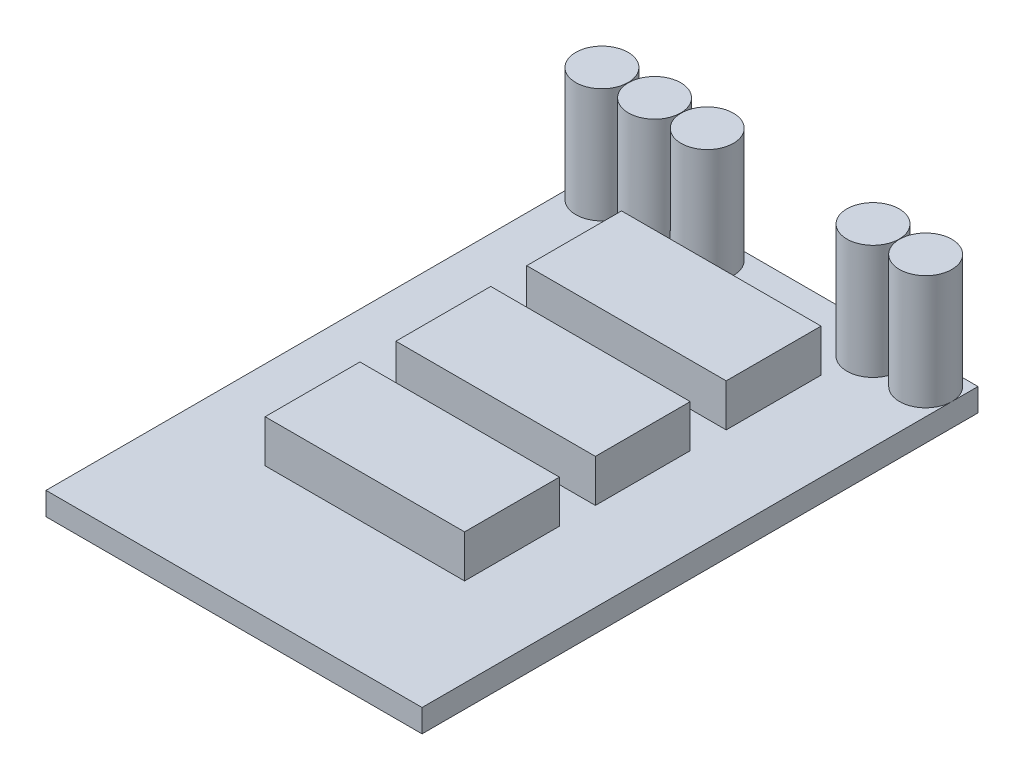
ISO-10303-21;
HEADER;
FILE_DESCRIPTION(('STEP AP214'),'2;1');
FILE_NAME('part.step','',(''),(''),'','','');
FILE_SCHEMA(('AUTOMOTIVE_DESIGN { 1 0 10303 214 1 1 1 1 }'));
ENDSEC;
DATA;
#1=APPLICATION_CONTEXT('core data for automotive mechanical design processes');
#2=APPLICATION_PROTOCOL_DEFINITION('international standard','automotive_design',2000,#1);
#3=PRODUCT_CONTEXT('',#1,'mechanical');
#4=PRODUCT('Part','Part','',(#3));
#5=PRODUCT_RELATED_PRODUCT_CATEGORY('part','',(#4));
#6=PRODUCT_DEFINITION_FORMATION('','',#4);
#7=PRODUCT_DEFINITION_CONTEXT('part definition',#1,'design');
#8=PRODUCT_DEFINITION('design','',#6,#7);
#9=PRODUCT_DEFINITION_SHAPE('','',#8);
#10=(LENGTH_UNIT() NAMED_UNIT(*) SI_UNIT(.MILLI.,.METRE.));
#11=(NAMED_UNIT(*) PLANE_ANGLE_UNIT() SI_UNIT($,.RADIAN.));
#12=(NAMED_UNIT(*) SI_UNIT($,.STERADIAN.) SOLID_ANGLE_UNIT());
#13=UNCERTAINTY_MEASURE_WITH_UNIT(LENGTH_MEASURE(1.E-05),#10,'distance_accuracy_value','');
#14=(GEOMETRIC_REPRESENTATION_CONTEXT(3) GLOBAL_UNCERTAINTY_ASSIGNED_CONTEXT((#13)) GLOBAL_UNIT_ASSIGNED_CONTEXT((#10,
#11,#12)) REPRESENTATION_CONTEXT('',''));
#15=CARTESIAN_POINT('',(0.,0.,0.));
#16=DIRECTION('',(0.,0.,1.));
#17=DIRECTION('',(1.,0.,0.));
#18=AXIS2_PLACEMENT_3D('',#15,#16,#17);
#19=CARTESIAN_POINT('',(0.,7.,0.));
#20=DIRECTION('',(0.,1.,0.));
#21=DIRECTION('',(0.,0.,1.));
#22=AXIS2_PLACEMENT_3D('',#19,#20,#21);
#23=PLANE('',#22);
#24=DIRECTION('',(-1.,0.,0.));
#25=VECTOR('',#24,1.);
#26=CARTESIAN_POINT('',(-57.5,7.,-85.));
#27=LINE('',#26,#25);
#28=CARTESIAN_POINT('',(57.5,7.,-85.));
#29=VERTEX_POINT('',#28);
#30=CARTESIAN_POINT('',(49.5,7.,-85.));
#31=VERTEX_POINT('',#30);
#32=EDGE_CURVE('E179',#29,#31,#27,.T.);
#33=ORIENTED_EDGE('',*,*,#32,.T.);
#34=CARTESIAN_POINT('',(49.5,7.,-77.));
#35=DIRECTION('',(0.,1.,0.));
#36=DIRECTION('',(0.,0.,1.));
#37=AXIS2_PLACEMENT_3D('',#34,#35,#36);
#38=CIRCLE('',#37,8.);
#39=CARTESIAN_POINT('',(57.5,7.,-77.));
#40=VERTEX_POINT('',#39);
#41=EDGE_CURVE('E52',#40,#31,#38,.T.);
#42=ORIENTED_EDGE('',*,*,#41,.F.);
#43=DIRECTION('',(0.,0.,-1.));
#44=VECTOR('',#43,1.);
#45=CARTESIAN_POINT('',(57.5,7.,-85.));
#46=LINE('',#45,#44);
#47=EDGE_CURVE('E177',#40,#29,#46,.T.);
#48=ORIENTED_EDGE('',*,*,#47,.T.);
#49=EDGE_LOOP('',(#33,#42,#48));
#50=FACE_BOUND('',#49,.T.);
#51=ADVANCED_FACE('F38',(#50),#23,.T.);
#52=DIRECTION('',(0.,0.,1.));
#53=VECTOR('',#52,1.);
#54=CARTESIAN_POINT('',(-57.5,7.,-85.));
#55=LINE('',#54,#53);
#56=CARTESIAN_POINT('',(-57.5,7.,-85.));
#57=VERTEX_POINT('',#56);
#58=CARTESIAN_POINT('',(-57.5,7.,-77.));
#59=VERTEX_POINT('',#58);
#60=EDGE_CURVE('E202',#57,#59,#55,.T.);
#61=ORIENTED_EDGE('',*,*,#60,.T.);
#62=CARTESIAN_POINT('',(-49.5,7.,-77.));
#63=DIRECTION('',(0.,1.,0.));
#64=DIRECTION('',(0.,0.,1.));
#65=AXIS2_PLACEMENT_3D('',#62,#63,#64);
#66=CIRCLE('',#65,8.);
#67=CARTESIAN_POINT('',(-49.5,7.,-85.));
#68=VERTEX_POINT('',#67);
#69=EDGE_CURVE('E237',#68,#59,#66,.T.);
#70=ORIENTED_EDGE('',*,*,#69,.F.);
#71=EDGE_CURVE('E194',#68,#57,#27,.T.);
#72=ORIENTED_EDGE('',*,*,#71,.T.);
#73=EDGE_LOOP('',(#61,#70,#72));
#74=FACE_BOUND('',#73,.T.);
#75=ADVANCED_FACE('F236',(#74),#23,.T.);
#76=DIRECTION('',(1.,0.,0.));
#77=VECTOR('',#76,1.);
#78=CARTESIAN_POINT('',(0.,7.,-24.));
#79=LINE('',#78,#77);
#80=CARTESIAN_POINT('',(-30.5,7.,-24.));
#81=VERTEX_POINT('',#80);
#82=CARTESIAN_POINT('',(30.5,7.,-24.));
#83=VERTEX_POINT('',#82);
#84=EDGE_CURVE('E303',#81,#83,#79,.T.);
#85=ORIENTED_EDGE('',*,*,#84,.T.);
#86=DIRECTION('',(0.,0.,1.));
#87=VECTOR('',#86,1.);
#88=CARTESIAN_POINT('',(30.5,7.,0.));
#89=LINE('',#88,#87);
#90=CARTESIAN_POINT('',(30.5,7.,4.99999999999997));
#91=VERTEX_POINT('',#90);
#92=EDGE_CURVE('E308',#83,#91,#89,.T.);
#93=ORIENTED_EDGE('',*,*,#92,.T.);
#94=DIRECTION('',(1.,0.,0.));
#95=VECTOR('',#94,1.);
#96=CARTESIAN_POINT('',(0.,7.,4.99999999999997));
#97=LINE('',#96,#95);
#98=CARTESIAN_POINT('',(-30.5,7.,4.99999999999998));
#99=VERTEX_POINT('',#98);
#100=EDGE_CURVE('E320',#99,#91,#97,.T.);
#101=ORIENTED_EDGE('',*,*,#100,.F.);
#102=DIRECTION('',(0.,0.,1.));
#103=VECTOR('',#102,1.);
#104=CARTESIAN_POINT('',(-30.5,7.,0.));
#105=LINE('',#104,#103);
#106=EDGE_CURVE('E317',#81,#99,#105,.T.);
#107=ORIENTED_EDGE('',*,*,#106,.F.);
#108=EDGE_LOOP('',(#85,#93,#101,#107));
#109=FACE_BOUND('',#108,.T.);
#110=CARTESIAN_POINT('',(57.5,7.,85.));
#111=VERTEX_POINT('',#110);
#112=EDGE_CURVE('E186',#111,#40,#46,.T.);
#113=ORIENTED_EDGE('',*,*,#112,.T.);
#114=EDGE_CURVE('E170',#31,#40,#38,.T.);
#115=ORIENTED_EDGE('',*,*,#114,.F.);
#116=CARTESIAN_POINT('',(33.4,7.,-85.));
#117=VERTEX_POINT('',#116);
#118=EDGE_CURVE('E59',#31,#117,#27,.T.);
#119=ORIENTED_EDGE('',*,*,#118,.T.);
#120=CARTESIAN_POINT('',(33.4,7.,-77.));
#121=DIRECTION('',(0.,1.,0.));
#122=DIRECTION('',(0.,0.,1.));
#123=AXIS2_PLACEMENT_3D('',#120,#121,#122);
#124=CIRCLE('',#123,8.);
#125=EDGE_CURVE('E250',#117,#117,#124,.T.);
#126=ORIENTED_EDGE('',*,*,#125,.F.);
#127=CARTESIAN_POINT('',(-17.3,7.,-85.));
#128=VERTEX_POINT('',#127);
#129=EDGE_CURVE('E245',#117,#128,#27,.T.);
#130=ORIENTED_EDGE('',*,*,#129,.T.);
#131=CARTESIAN_POINT('',(-17.3,7.,-77.));
#132=DIRECTION('',(0.,1.,0.));
#133=DIRECTION('',(0.,0.,1.));
#134=AXIS2_PLACEMENT_3D('',#131,#132,#133);
#135=CIRCLE('',#134,8.00000000000001);
#136=EDGE_CURVE('E249',#128,#128,#135,.T.);
#137=ORIENTED_EDGE('',*,*,#136,.F.);
#138=CARTESIAN_POINT('',(-33.4,7.,-85.));
#139=VERTEX_POINT('',#138);
#140=EDGE_CURVE('E242',#128,#139,#27,.T.);
#141=ORIENTED_EDGE('',*,*,#140,.T.);
#142=CARTESIAN_POINT('',(-33.4,7.,-77.));
#143=DIRECTION('',(0.,1.,0.));
#144=DIRECTION('',(0.,0.,1.));
#145=AXIS2_PLACEMENT_3D('',#142,#143,#144);
#146=CIRCLE('',#145,8.00000000000001);
#147=EDGE_CURVE('E257',#139,#139,#146,.T.);
#148=ORIENTED_EDGE('',*,*,#147,.F.);
#149=EDGE_CURVE('E195',#139,#68,#27,.T.);
#150=ORIENTED_EDGE('',*,*,#149,.T.);
#151=EDGE_CURVE('E266',#59,#68,#66,.T.);
#152=ORIENTED_EDGE('',*,*,#151,.F.);
#153=CARTESIAN_POINT('',(-57.5,7.,85.));
#154=VERTEX_POINT('',#153);
#155=EDGE_CURVE('E201',#59,#154,#55,.T.);
#156=ORIENTED_EDGE('',*,*,#155,.T.);
#157=DIRECTION('',(1.,0.,0.));
#158=VECTOR('',#157,1.);
#159=CARTESIAN_POINT('',(-57.5,7.,85.));
#160=LINE('',#159,#158);
#161=EDGE_CURVE('E192',#154,#111,#160,.T.);
#162=ORIENTED_EDGE('',*,*,#161,.T.);
#163=EDGE_LOOP('',(#113,#115,#119,#126,#130,#137,#141,#148,#150,#152,#156,#162));
#164=FACE_BOUND('',#163,.T.);
#165=DIRECTION('',(0.,0.,1.));
#166=VECTOR('',#165,1.);
#167=CARTESIAN_POINT('',(30.5,7.,0.));
#168=LINE('',#167,#166);
#169=CARTESIAN_POINT('',(30.5,7.,-64.));
#170=VERTEX_POINT('',#169);
#171=CARTESIAN_POINT('',(30.5,7.,-35.));
#172=VERTEX_POINT('',#171);
#173=EDGE_CURVE('E350',#170,#172,#168,.T.);
#174=ORIENTED_EDGE('',*,*,#173,.T.);
#175=DIRECTION('',(1.,0.,0.));
#176=VECTOR('',#175,1.);
#177=CARTESIAN_POINT('',(0.,7.,-35.));
#178=LINE('',#177,#176);
#179=CARTESIAN_POINT('',(-30.5,7.,-35.));
#180=VERTEX_POINT('',#179);
#181=EDGE_CURVE('E335',#180,#172,#178,.T.);
#182=ORIENTED_EDGE('',*,*,#181,.F.);
#183=DIRECTION('',(0.,0.,1.));
#184=VECTOR('',#183,1.);
#185=CARTESIAN_POINT('',(-30.5,7.,0.));
#186=LINE('',#185,#184);
#187=CARTESIAN_POINT('',(-30.5,7.,-64.));
#188=VERTEX_POINT('',#187);
#189=EDGE_CURVE('E339',#188,#180,#186,.T.);
#190=ORIENTED_EDGE('',*,*,#189,.F.);
#191=DIRECTION('',(1.,0.,0.));
#192=VECTOR('',#191,1.);
#193=CARTESIAN_POINT('',(0.,7.,-64.));
#194=LINE('',#193,#192);
#195=EDGE_CURVE('E353',#188,#170,#194,.T.);
#196=ORIENTED_EDGE('',*,*,#195,.T.);
#197=EDGE_LOOP('',(#174,#182,#190,#196));
#198=FACE_BOUND('',#197,.T.);
#199=DIRECTION('',(0.,0.,1.));
#200=VECTOR('',#199,1.);
#201=CARTESIAN_POINT('',(30.5,7.,0.));
#202=LINE('',#201,#200);
#203=CARTESIAN_POINT('',(30.5,7.,16.));
#204=VERTEX_POINT('',#203);
#205=CARTESIAN_POINT('',(30.5,7.,45.));
#206=VERTEX_POINT('',#205);
#207=EDGE_CURVE('E287',#204,#206,#202,.T.);
#208=ORIENTED_EDGE('',*,*,#207,.T.);
#209=DIRECTION('',(1.,0.,0.));
#210=VECTOR('',#209,1.);
#211=CARTESIAN_POINT('',(0.,7.,45.));
#212=LINE('',#211,#210);
#213=CARTESIAN_POINT('',(-30.5,7.,45.));
#214=VERTEX_POINT('',#213);
#215=EDGE_CURVE('E271',#214,#206,#212,.T.);
#216=ORIENTED_EDGE('',*,*,#215,.F.);
#217=DIRECTION('',(0.,0.,1.));
#218=VECTOR('',#217,1.);
#219=CARTESIAN_POINT('',(-30.5,7.,0.));
#220=LINE('',#219,#218);
#221=CARTESIAN_POINT('',(-30.5,7.,16.));
#222=VERTEX_POINT('',#221);
#223=EDGE_CURVE('E276',#222,#214,#220,.T.);
#224=ORIENTED_EDGE('',*,*,#223,.F.);
#225=DIRECTION('',(1.,0.,0.));
#226=VECTOR('',#225,1.);
#227=CARTESIAN_POINT('',(0.,7.,16.));
#228=LINE('',#227,#226);
#229=EDGE_CURVE('E290',#222,#204,#228,.T.);
#230=ORIENTED_EDGE('',*,*,#229,.T.);
#231=EDGE_LOOP('',(#208,#216,#224,#230));
#232=FACE_BOUND('',#231,.T.);
#233=ADVANCED_FACE('F189',(#109,#164,#198,#232),#23,.T.);
#234=CARTESIAN_POINT('',(57.5,7.,-85.));
#235=DIRECTION('',(-1.,0.,0.));
#236=DIRECTION('',(0.,0.,1.));
#237=AXIS2_PLACEMENT_3D('',#234,#235,#236);
#238=PLANE('',#237);
#239=DIRECTION('',(0.,0.,-1.));
#240=VECTOR('',#239,1.);
#241=CARTESIAN_POINT('',(57.5,0.,-85.));
#242=LINE('',#241,#240);
#243=CARTESIAN_POINT('',(57.5,0.,85.));
#244=VERTEX_POINT('',#243);
#245=CARTESIAN_POINT('',(57.5,0.,-85.));
#246=VERTEX_POINT('',#245);
#247=EDGE_CURVE('E207',#244,#246,#242,.T.);
#248=ORIENTED_EDGE('',*,*,#247,.T.);
#249=DIRECTION('',(0.,-1.,0.));
#250=VECTOR('',#249,1.);
#251=CARTESIAN_POINT('',(57.5,7.,-85.));
#252=LINE('',#251,#250);
#253=EDGE_CURVE('E11',#29,#246,#252,.T.);
#254=ORIENTED_EDGE('',*,*,#253,.F.);
#255=ORIENTED_EDGE('',*,*,#47,.F.);
#256=ORIENTED_EDGE('',*,*,#112,.F.);
#257=DIRECTION('',(0.,-1.,0.));
#258=VECTOR('',#257,1.);
#259=CARTESIAN_POINT('',(57.5,7.,85.));
#260=LINE('',#259,#258);
#261=EDGE_CURVE('E206',#111,#244,#260,.T.);
#262=ORIENTED_EDGE('',*,*,#261,.T.);
#263=EDGE_LOOP('',(#248,#254,#255,#256,#262));
#264=FACE_BOUND('',#263,.T.);
#265=ADVANCED_FACE('F40',(#264),#238,.F.);
#266=CARTESIAN_POINT('',(-57.5,7.,-85.));
#267=DIRECTION('',(0.,0.,1.));
#268=DIRECTION('',(1.,0.,0.));
#269=AXIS2_PLACEMENT_3D('',#266,#267,#268);
#270=PLANE('',#269);
#271=DIRECTION('',(-1.,0.,0.));
#272=VECTOR('',#271,1.);
#273=CARTESIAN_POINT('',(-57.5,0.,-85.));
#274=LINE('',#273,#272);
#275=CARTESIAN_POINT('',(-57.5,0.,-85.));
#276=VERTEX_POINT('',#275);
#277=EDGE_CURVE('E209',#246,#276,#274,.T.);
#278=ORIENTED_EDGE('',*,*,#277,.T.);
#279=DIRECTION('',(0.,-1.,0.));
#280=VECTOR('',#279,1.);
#281=CARTESIAN_POINT('',(-57.5,7.,-85.));
#282=LINE('',#281,#280);
#283=EDGE_CURVE('E46',#57,#276,#282,.T.);
#284=ORIENTED_EDGE('',*,*,#283,.F.);
#285=ORIENTED_EDGE('',*,*,#71,.F.);
#286=ORIENTED_EDGE('',*,*,#149,.F.);
#287=ORIENTED_EDGE('',*,*,#140,.F.);
#288=ORIENTED_EDGE('',*,*,#129,.F.);
#289=ORIENTED_EDGE('',*,*,#118,.F.);
#290=ORIENTED_EDGE('',*,*,#32,.F.);
#291=ORIENTED_EDGE('',*,*,#253,.T.);
#292=EDGE_LOOP('',(#278,#284,#285,#286,#287,#288,#289,#290,#291));
#293=FACE_BOUND('',#292,.T.);
#294=ADVANCED_FACE('F239',(#293),#270,.F.);
#295=CARTESIAN_POINT('',(-57.5,7.,-85.));
#296=DIRECTION('',(1.,0.,0.));
#297=DIRECTION('',(0.,0.,-1.));
#298=AXIS2_PLACEMENT_3D('',#295,#296,#297);
#299=PLANE('',#298);
#300=DIRECTION('',(0.,0.,1.));
#301=VECTOR('',#300,1.);
#302=CARTESIAN_POINT('',(-57.5,0.,-85.));
#303=LINE('',#302,#301);
#304=CARTESIAN_POINT('',(-57.5,0.,85.));
#305=VERTEX_POINT('',#304);
#306=EDGE_CURVE('E211',#276,#305,#303,.T.);
#307=ORIENTED_EDGE('',*,*,#306,.T.);
#308=DIRECTION('',(0.,-1.,0.));
#309=VECTOR('',#308,1.);
#310=CARTESIAN_POINT('',(-57.5,7.,85.));
#311=LINE('',#310,#309);
#312=EDGE_CURVE('E215',#154,#305,#311,.T.);
#313=ORIENTED_EDGE('',*,*,#312,.F.);
#314=ORIENTED_EDGE('',*,*,#155,.F.);
#315=ORIENTED_EDGE('',*,*,#60,.F.);
#316=ORIENTED_EDGE('',*,*,#283,.T.);
#317=EDGE_LOOP('',(#307,#313,#314,#315,#316));
#318=FACE_BOUND('',#317,.T.);
#319=ADVANCED_FACE('F222',(#318),#299,.F.);
#320=CARTESIAN_POINT('',(-57.5,7.,85.));
#321=DIRECTION('',(0.,0.,-1.));
#322=DIRECTION('',(-1.,0.,0.));
#323=AXIS2_PLACEMENT_3D('',#320,#321,#322);
#324=PLANE('',#323);
#325=DIRECTION('',(1.,0.,0.));
#326=VECTOR('',#325,1.);
#327=CARTESIAN_POINT('',(-57.5,0.,85.));
#328=LINE('',#327,#326);
#329=EDGE_CURVE('E187',#305,#244,#328,.T.);
#330=ORIENTED_EDGE('',*,*,#329,.T.);
#331=ORIENTED_EDGE('',*,*,#261,.F.);
#332=ORIENTED_EDGE('',*,*,#161,.F.);
#333=ORIENTED_EDGE('',*,*,#312,.T.);
#334=EDGE_LOOP('',(#330,#331,#332,#333));
#335=FACE_BOUND('',#334,.T.);
#336=ADVANCED_FACE('F232',(#335),#324,.F.);
#337=CARTESIAN_POINT('',(0.,0.,0.));
#338=DIRECTION('',(0.,1.,0.));
#339=DIRECTION('',(0.,0.,1.));
#340=AXIS2_PLACEMENT_3D('',#337,#338,#339);
#341=PLANE('',#340);
#342=ORIENTED_EDGE('',*,*,#247,.F.);
#343=ORIENTED_EDGE('',*,*,#329,.F.);
#344=ORIENTED_EDGE('',*,*,#306,.F.);
#345=ORIENTED_EDGE('',*,*,#277,.F.);
#346=EDGE_LOOP('',(#342,#343,#344,#345));
#347=FACE_BOUND('',#346,.T.);
#348=ADVANCED_FACE('F230',(#347),#341,.F.);
#349=CARTESIAN_POINT('',(0.,20.,-35.));
#350=DIRECTION('',(0.,0.,-1.));
#351=DIRECTION('',(-1.,0.,0.));
#352=AXIS2_PLACEMENT_3D('',#349,#350,#351);
#353=PLANE('',#352);
#354=ORIENTED_EDGE('',*,*,#181,.T.);
#355=DIRECTION('',(0.,-1.,0.));
#356=VECTOR('',#355,1.);
#357=CARTESIAN_POINT('',(30.5,20.,-35.));
#358=LINE('',#357,#356);
#359=CARTESIAN_POINT('',(30.5,20.,-35.));
#360=VERTEX_POINT('',#359);
#361=EDGE_CURVE('E198',#360,#172,#358,.T.);
#362=ORIENTED_EDGE('',*,*,#361,.F.);
#363=DIRECTION('',(1.,0.,0.));
#364=VECTOR('',#363,1.);
#365=CARTESIAN_POINT('',(0.,20.,-35.));
#366=LINE('',#365,#364);
#367=CARTESIAN_POINT('',(-30.5,20.,-35.));
#368=VERTEX_POINT('',#367);
#369=EDGE_CURVE('E336',#368,#360,#366,.T.);
#370=ORIENTED_EDGE('',*,*,#369,.F.);
#371=DIRECTION('',(0.,-1.,0.));
#372=VECTOR('',#371,1.);
#373=CARTESIAN_POINT('',(-30.5,20.,-35.));
#374=LINE('',#373,#372);
#375=EDGE_CURVE('E347',#368,#180,#374,.T.);
#376=ORIENTED_EDGE('',*,*,#375,.T.);
#377=EDGE_LOOP('',(#354,#362,#370,#376));
#378=FACE_BOUND('',#377,.T.);
#379=ADVANCED_FACE('F371',(#378),#353,.F.);
#380=CARTESIAN_POINT('',(30.5,20.,0.));
#381=DIRECTION('',(1.,0.,0.));
#382=DIRECTION('',(0.,0.,-1.));
#383=AXIS2_PLACEMENT_3D('',#380,#381,#382);
#384=PLANE('',#383);
#385=ORIENTED_EDGE('',*,*,#173,.F.);
#386=DIRECTION('',(0.,-1.,0.));
#387=VECTOR('',#386,1.);
#388=CARTESIAN_POINT('',(30.5,20.,-64.));
#389=LINE('',#388,#387);
#390=CARTESIAN_POINT('',(30.5,20.,-64.));
#391=VERTEX_POINT('',#390);
#392=EDGE_CURVE('E361',#391,#170,#389,.T.);
#393=ORIENTED_EDGE('',*,*,#392,.F.);
#394=DIRECTION('',(0.,0.,1.));
#395=VECTOR('',#394,1.);
#396=CARTESIAN_POINT('',(30.5,20.,0.));
#397=LINE('',#396,#395);
#398=EDGE_CURVE('E338',#391,#360,#397,.T.);
#399=ORIENTED_EDGE('',*,*,#398,.T.);
#400=ORIENTED_EDGE('',*,*,#361,.T.);
#401=EDGE_LOOP('',(#385,#393,#399,#400));
#402=FACE_BOUND('',#401,.T.);
#403=ADVANCED_FACE('F366',(#402),#384,.T.);
#404=CARTESIAN_POINT('',(0.,20.,-64.));
#405=DIRECTION('',(0.,0.,-1.));
#406=DIRECTION('',(-1.,0.,0.));
#407=AXIS2_PLACEMENT_3D('',#404,#405,#406);
#408=PLANE('',#407);
#409=ORIENTED_EDGE('',*,*,#195,.F.);
#410=DIRECTION('',(0.,-1.,0.));
#411=VECTOR('',#410,1.);
#412=CARTESIAN_POINT('',(-30.5,20.,-64.));
#413=LINE('',#412,#411);
#414=CARTESIAN_POINT('',(-30.5,20.,-64.));
#415=VERTEX_POINT('',#414);
#416=EDGE_CURVE('E359',#415,#188,#413,.T.);
#417=ORIENTED_EDGE('',*,*,#416,.F.);
#418=DIRECTION('',(1.,0.,0.));
#419=VECTOR('',#418,1.);
#420=CARTESIAN_POINT('',(0.,20.,-64.));
#421=LINE('',#420,#419);
#422=EDGE_CURVE('E342',#415,#391,#421,.T.);
#423=ORIENTED_EDGE('',*,*,#422,.T.);
#424=ORIENTED_EDGE('',*,*,#392,.T.);
#425=EDGE_LOOP('',(#409,#417,#423,#424));
#426=FACE_BOUND('',#425,.T.);
#427=ADVANCED_FACE('F375',(#426),#408,.T.);
#428=CARTESIAN_POINT('',(-30.5,20.,0.));
#429=DIRECTION('',(1.,0.,0.));
#430=DIRECTION('',(0.,0.,-1.));
#431=AXIS2_PLACEMENT_3D('',#428,#429,#430);
#432=PLANE('',#431);
#433=ORIENTED_EDGE('',*,*,#189,.T.);
#434=ORIENTED_EDGE('',*,*,#375,.F.);
#435=DIRECTION('',(0.,0.,1.));
#436=VECTOR('',#435,1.);
#437=CARTESIAN_POINT('',(-30.5,20.,0.));
#438=LINE('',#437,#436);
#439=EDGE_CURVE('E345',#415,#368,#438,.T.);
#440=ORIENTED_EDGE('',*,*,#439,.F.);
#441=ORIENTED_EDGE('',*,*,#416,.T.);
#442=EDGE_LOOP('',(#433,#434,#440,#441));
#443=FACE_BOUND('',#442,.T.);
#444=ADVANCED_FACE('F378',(#443),#432,.F.);
#445=CARTESIAN_POINT('',(0.,20.,0.));
#446=DIRECTION('',(0.,1.,0.));
#447=DIRECTION('',(0.,0.,1.));
#448=AXIS2_PLACEMENT_3D('',#445,#446,#447);
#449=PLANE('',#448);
#450=ORIENTED_EDGE('',*,*,#369,.T.);
#451=ORIENTED_EDGE('',*,*,#398,.F.);
#452=ORIENTED_EDGE('',*,*,#422,.F.);
#453=ORIENTED_EDGE('',*,*,#439,.T.);
#454=EDGE_LOOP('',(#450,#451,#452,#453));
#455=FACE_BOUND('',#454,.T.);
#456=ADVANCED_FACE('F381',(#455),#449,.T.);
#457=CARTESIAN_POINT('',(0.,20.,-24.));
#458=DIRECTION('',(0.,0.,-1.));
#459=DIRECTION('',(-1.,0.,0.));
#460=AXIS2_PLACEMENT_3D('',#457,#458,#459);
#461=PLANE('',#460);
#462=ORIENTED_EDGE('',*,*,#84,.F.);
#463=DIRECTION('',(0.,-1.,0.));
#464=VECTOR('',#463,1.);
#465=CARTESIAN_POINT('',(-30.5,20.,-24.));
#466=LINE('',#465,#464);
#467=CARTESIAN_POINT('',(-30.5,20.,-24.));
#468=VERTEX_POINT('',#467);
#469=EDGE_CURVE('E332',#468,#81,#466,.T.);
#470=ORIENTED_EDGE('',*,*,#469,.F.);
#471=DIRECTION('',(1.,0.,0.));
#472=VECTOR('',#471,1.);
#473=CARTESIAN_POINT('',(0.,20.,-24.));
#474=LINE('',#473,#472);
#475=CARTESIAN_POINT('',(30.5,20.,-24.));
#476=VERTEX_POINT('',#475);
#477=EDGE_CURVE('E304',#468,#476,#474,.T.);
#478=ORIENTED_EDGE('',*,*,#477,.T.);
#479=DIRECTION('',(0.,-1.,0.));
#480=VECTOR('',#479,1.);
#481=CARTESIAN_POINT('',(30.5,20.,-24.));
#482=LINE('',#481,#480);
#483=EDGE_CURVE('E315',#476,#83,#482,.T.);
#484=ORIENTED_EDGE('',*,*,#483,.T.);
#485=EDGE_LOOP('',(#462,#470,#478,#484));
#486=FACE_BOUND('',#485,.T.);
#487=ADVANCED_FACE('F383',(#486),#461,.T.);
#488=CARTESIAN_POINT('',(-30.5,20.,0.));
#489=DIRECTION('',(1.,0.,0.));
#490=DIRECTION('',(0.,0.,-1.));
#491=AXIS2_PLACEMENT_3D('',#488,#489,#490);
#492=PLANE('',#491);
#493=ORIENTED_EDGE('',*,*,#106,.T.);
#494=DIRECTION('',(0.,-1.,0.));
#495=VECTOR('',#494,1.);
#496=CARTESIAN_POINT('',(-30.5,20.,4.99999999999998));
#497=LINE('',#496,#495);
#498=CARTESIAN_POINT('',(-30.5,20.,4.99999999999998));
#499=VERTEX_POINT('',#498);
#500=EDGE_CURVE('E329',#499,#99,#497,.T.);
#501=ORIENTED_EDGE('',*,*,#500,.F.);
#502=DIRECTION('',(0.,0.,1.));
#503=VECTOR('',#502,1.);
#504=CARTESIAN_POINT('',(-30.5,20.,0.));
#505=LINE('',#504,#503);
#506=EDGE_CURVE('E307',#468,#499,#505,.T.);
#507=ORIENTED_EDGE('',*,*,#506,.F.);
#508=ORIENTED_EDGE('',*,*,#469,.T.);
#509=EDGE_LOOP('',(#493,#501,#507,#508));
#510=FACE_BOUND('',#509,.T.);
#511=ADVANCED_FACE('F389',(#510),#492,.F.);
#512=CARTESIAN_POINT('',(0.,20.,4.99999999999997));
#513=DIRECTION('',(0.,0.,-1.));
#514=DIRECTION('',(-1.,0.,0.));
#515=AXIS2_PLACEMENT_3D('',#512,#513,#514);
#516=PLANE('',#515);
#517=ORIENTED_EDGE('',*,*,#100,.T.);
#518=DIRECTION('',(0.,-1.,0.));
#519=VECTOR('',#518,1.);
#520=CARTESIAN_POINT('',(30.5,20.,4.99999999999997));
#521=LINE('',#520,#519);
#522=CARTESIAN_POINT('',(30.5,20.,4.99999999999997));
#523=VERTEX_POINT('',#522);
#524=EDGE_CURVE('E326',#523,#91,#521,.T.);
#525=ORIENTED_EDGE('',*,*,#524,.F.);
#526=DIRECTION('',(1.,0.,0.));
#527=VECTOR('',#526,1.);
#528=CARTESIAN_POINT('',(0.,20.,4.99999999999997));
#529=LINE('',#528,#527);
#530=EDGE_CURVE('E310',#499,#523,#529,.T.);
#531=ORIENTED_EDGE('',*,*,#530,.F.);
#532=ORIENTED_EDGE('',*,*,#500,.T.);
#533=EDGE_LOOP('',(#517,#525,#531,#532));
#534=FACE_BOUND('',#533,.T.);
#535=ADVANCED_FACE('F414',(#534),#516,.F.);
#536=CARTESIAN_POINT('',(30.5,20.,0.));
#537=DIRECTION('',(1.,0.,0.));
#538=DIRECTION('',(0.,0.,-1.));
#539=AXIS2_PLACEMENT_3D('',#536,#537,#538);
#540=PLANE('',#539);
#541=ORIENTED_EDGE('',*,*,#92,.F.);
#542=ORIENTED_EDGE('',*,*,#483,.F.);
#543=DIRECTION('',(0.,0.,1.));
#544=VECTOR('',#543,1.);
#545=CARTESIAN_POINT('',(30.5,20.,0.));
#546=LINE('',#545,#544);
#547=EDGE_CURVE('E312',#476,#523,#546,.T.);
#548=ORIENTED_EDGE('',*,*,#547,.T.);
#549=ORIENTED_EDGE('',*,*,#524,.T.);
#550=EDGE_LOOP('',(#541,#542,#548,#549));
#551=FACE_BOUND('',#550,.T.);
#552=ADVANCED_FACE('F410',(#551),#540,.T.);
#553=CARTESIAN_POINT('',(0.,20.,0.));
#554=DIRECTION('',(0.,1.,0.));
#555=DIRECTION('',(0.,0.,1.));
#556=AXIS2_PLACEMENT_3D('',#553,#554,#555);
#557=PLANE('',#556);
#558=ORIENTED_EDGE('',*,*,#477,.F.);
#559=ORIENTED_EDGE('',*,*,#506,.T.);
#560=ORIENTED_EDGE('',*,*,#530,.T.);
#561=ORIENTED_EDGE('',*,*,#547,.F.);
#562=EDGE_LOOP('',(#558,#559,#560,#561));
#563=FACE_BOUND('',#562,.T.);
#564=ADVANCED_FACE('F419',(#563),#557,.T.);
#565=CARTESIAN_POINT('',(0.,20.,45.));
#566=DIRECTION('',(0.,0.,-1.));
#567=DIRECTION('',(-1.,0.,0.));
#568=AXIS2_PLACEMENT_3D('',#565,#566,#567);
#569=PLANE('',#568);
#570=ORIENTED_EDGE('',*,*,#215,.T.);
#571=DIRECTION('',(0.,-1.,0.));
#572=VECTOR('',#571,1.);
#573=CARTESIAN_POINT('',(30.5,20.,45.));
#574=LINE('',#573,#572);
#575=CARTESIAN_POINT('',(30.5,20.,45.));
#576=VERTEX_POINT('',#575);
#577=EDGE_CURVE('E301',#576,#206,#574,.T.);
#578=ORIENTED_EDGE('',*,*,#577,.F.);
#579=DIRECTION('',(1.,0.,0.));
#580=VECTOR('',#579,1.);
#581=CARTESIAN_POINT('',(0.,20.,45.));
#582=LINE('',#581,#580);
#583=CARTESIAN_POINT('',(-30.5,20.,45.));
#584=VERTEX_POINT('',#583);
#585=EDGE_CURVE('E273',#584,#576,#582,.T.);
#586=ORIENTED_EDGE('',*,*,#585,.F.);
#587=DIRECTION('',(0.,-1.,0.));
#588=VECTOR('',#587,1.);
#589=CARTESIAN_POINT('',(-30.5,20.,45.));
#590=LINE('',#589,#588);
#591=EDGE_CURVE('E284',#584,#214,#590,.T.);
#592=ORIENTED_EDGE('',*,*,#591,.T.);
#593=EDGE_LOOP('',(#570,#578,#586,#592));
#594=FACE_BOUND('',#593,.T.);
#595=ADVANCED_FACE('F421',(#594),#569,.F.);
#596=CARTESIAN_POINT('',(30.5,20.,0.));
#597=DIRECTION('',(1.,0.,0.));
#598=DIRECTION('',(0.,0.,-1.));
#599=AXIS2_PLACEMENT_3D('',#596,#597,#598);
#600=PLANE('',#599);
#601=ORIENTED_EDGE('',*,*,#207,.F.);
#602=DIRECTION('',(0.,-1.,0.));
#603=VECTOR('',#602,1.);
#604=CARTESIAN_POINT('',(30.5,20.,16.));
#605=LINE('',#604,#603);
#606=CARTESIAN_POINT('',(30.5,20.,16.));
#607=VERTEX_POINT('',#606);
#608=EDGE_CURVE('E299',#607,#204,#605,.T.);
#609=ORIENTED_EDGE('',*,*,#608,.F.);
#610=DIRECTION('',(0.,0.,1.));
#611=VECTOR('',#610,1.);
#612=CARTESIAN_POINT('',(30.5,20.,0.));
#613=LINE('',#612,#611);
#614=EDGE_CURVE('E275',#607,#576,#613,.T.);
#615=ORIENTED_EDGE('',*,*,#614,.T.);
#616=ORIENTED_EDGE('',*,*,#577,.T.);
#617=EDGE_LOOP('',(#601,#609,#615,#616));
#618=FACE_BOUND('',#617,.T.);
#619=ADVANCED_FACE('F427',(#618),#600,.T.);
#620=CARTESIAN_POINT('',(0.,20.,16.));
#621=DIRECTION('',(0.,0.,-1.));
#622=DIRECTION('',(-1.,0.,0.));
#623=AXIS2_PLACEMENT_3D('',#620,#621,#622);
#624=PLANE('',#623);
#625=ORIENTED_EDGE('',*,*,#229,.F.);
#626=DIRECTION('',(0.,-1.,0.));
#627=VECTOR('',#626,1.);
#628=CARTESIAN_POINT('',(-30.5,20.,16.));
#629=LINE('',#628,#627);
#630=CARTESIAN_POINT('',(-30.5,20.,16.));
#631=VERTEX_POINT('',#630);
#632=EDGE_CURVE('E296',#631,#222,#629,.T.);
#633=ORIENTED_EDGE('',*,*,#632,.F.);
#634=DIRECTION('',(1.,0.,0.));
#635=VECTOR('',#634,1.);
#636=CARTESIAN_POINT('',(0.,20.,16.));
#637=LINE('',#636,#635);
#638=EDGE_CURVE('E279',#631,#607,#637,.T.);
#639=ORIENTED_EDGE('',*,*,#638,.T.);
#640=ORIENTED_EDGE('',*,*,#608,.T.);
#641=EDGE_LOOP('',(#625,#633,#639,#640));
#642=FACE_BOUND('',#641,.T.);
#643=ADVANCED_FACE('F468',(#642),#624,.T.);
#644=CARTESIAN_POINT('',(-30.5,20.,0.));
#645=DIRECTION('',(1.,0.,0.));
#646=DIRECTION('',(0.,0.,-1.));
#647=AXIS2_PLACEMENT_3D('',#644,#645,#646);
#648=PLANE('',#647);
#649=ORIENTED_EDGE('',*,*,#223,.T.);
#650=ORIENTED_EDGE('',*,*,#591,.F.);
#651=DIRECTION('',(0.,0.,1.));
#652=VECTOR('',#651,1.);
#653=CARTESIAN_POINT('',(-30.5,20.,0.));
#654=LINE('',#653,#652);
#655=EDGE_CURVE('E282',#631,#584,#654,.T.);
#656=ORIENTED_EDGE('',*,*,#655,.F.);
#657=ORIENTED_EDGE('',*,*,#632,.T.);
#658=EDGE_LOOP('',(#649,#650,#656,#657));
#659=FACE_BOUND('',#658,.T.);
#660=ADVANCED_FACE('F477',(#659),#648,.F.);
#661=CARTESIAN_POINT('',(0.,20.,0.));
#662=DIRECTION('',(0.,1.,0.));
#663=DIRECTION('',(0.,0.,1.));
#664=AXIS2_PLACEMENT_3D('',#661,#662,#663);
#665=PLANE('',#664);
#666=ORIENTED_EDGE('',*,*,#585,.T.);
#667=ORIENTED_EDGE('',*,*,#614,.F.);
#668=ORIENTED_EDGE('',*,*,#638,.F.);
#669=ORIENTED_EDGE('',*,*,#655,.T.);
#670=EDGE_LOOP('',(#666,#667,#668,#669));
#671=FACE_BOUND('',#670,.T.);
#672=ADVANCED_FACE('F487',(#671),#665,.T.);
#673=CARTESIAN_POINT('',(-49.5,42.,-77.));
#674=DIRECTION('',(0.,-1.,0.));
#675=DIRECTION('',(0.,0.,-1.));
#676=AXIS2_PLACEMENT_3D('',#673,#674,#675);
#677=CYLINDRICAL_SURFACE('',#676,8.);
#678=CARTESIAN_POINT('',(-49.5,42.,-77.));
#679=DIRECTION('',(0.,1.,0.));
#680=DIRECTION('',(0.,0.,1.));
#681=AXIS2_PLACEMENT_3D('',#678,#679,#680);
#682=CIRCLE('',#681,8.);
#683=CARTESIAN_POINT('',(-49.5,42.,-69.));
#684=VERTEX_POINT('',#683);
#685=EDGE_CURVE('E268',#684,#684,#682,.T.);
#686=ORIENTED_EDGE('',*,*,#685,.F.);
#687=EDGE_LOOP('',(#686));
#688=FACE_BOUND('',#687,.T.);
#689=ORIENTED_EDGE('',*,*,#69,.T.);
#690=ORIENTED_EDGE('',*,*,#151,.T.);
#691=EDGE_LOOP('',(#689,#690));
#692=FACE_BOUND('',#691,.T.);
#693=ADVANCED_FACE('F497',(#688,#692),#677,.T.);
#694=CARTESIAN_POINT('',(0.,42.,0.));
#695=DIRECTION('',(0.,1.,0.));
#696=DIRECTION('',(0.,0.,1.));
#697=AXIS2_PLACEMENT_3D('',#694,#695,#696);
#698=PLANE('',#697);
#699=ORIENTED_EDGE('',*,*,#685,.T.);
#700=EDGE_LOOP('',(#699));
#701=FACE_BOUND('',#700,.T.);
#702=ADVANCED_FACE('F547',(#701),#698,.T.);
#703=CARTESIAN_POINT('',(-33.4,42.,-77.));
#704=DIRECTION('',(0.,-1.,0.));
#705=DIRECTION('',(0.,0.,-1.));
#706=AXIS2_PLACEMENT_3D('',#703,#704,#705);
#707=CYLINDRICAL_SURFACE('',#706,8.00000000000001);
#708=CARTESIAN_POINT('',(-33.4,42.,-77.));
#709=DIRECTION('',(0.,1.,0.));
#710=DIRECTION('',(0.,0.,1.));
#711=AXIS2_PLACEMENT_3D('',#708,#709,#710);
#712=CIRCLE('',#711,8.00000000000001);
#713=CARTESIAN_POINT('',(-33.4,42.,-69.));
#714=VERTEX_POINT('',#713);
#715=EDGE_CURVE('E263',#714,#714,#712,.T.);
#716=ORIENTED_EDGE('',*,*,#715,.F.);
#717=EDGE_LOOP('',(#716));
#718=FACE_BOUND('',#717,.T.);
#719=ORIENTED_EDGE('',*,*,#147,.T.);
#720=EDGE_LOOP('',(#719));
#721=FACE_BOUND('',#720,.T.);
#722=ADVANCED_FACE('F557',(#718,#721),#707,.T.);
#723=CARTESIAN_POINT('',(0.,42.,0.));
#724=DIRECTION('',(0.,1.,0.));
#725=DIRECTION('',(0.,0.,1.));
#726=AXIS2_PLACEMENT_3D('',#723,#724,#725);
#727=PLANE('',#726);
#728=ORIENTED_EDGE('',*,*,#715,.T.);
#729=EDGE_LOOP('',(#728));
#730=FACE_BOUND('',#729,.T.);
#731=ADVANCED_FACE('F567',(#730),#727,.T.);
#732=CARTESIAN_POINT('',(-17.3,42.,-77.));
#733=DIRECTION('',(0.,-1.,0.));
#734=DIRECTION('',(0.,0.,-1.));
#735=AXIS2_PLACEMENT_3D('',#732,#733,#734);
#736=CYLINDRICAL_SURFACE('',#735,8.00000000000001);
#737=CARTESIAN_POINT('',(-17.3,42.,-77.));
#738=DIRECTION('',(0.,1.,0.));
#739=DIRECTION('',(0.,0.,1.));
#740=AXIS2_PLACEMENT_3D('',#737,#738,#739);
#741=CIRCLE('',#740,8.00000000000001);
#742=CARTESIAN_POINT('',(-17.3,42.,-69.));
#743=VERTEX_POINT('',#742);
#744=EDGE_CURVE('E253',#743,#743,#741,.T.);
#745=ORIENTED_EDGE('',*,*,#744,.F.);
#746=EDGE_LOOP('',(#745));
#747=FACE_BOUND('',#746,.T.);
#748=ORIENTED_EDGE('',*,*,#136,.T.);
#749=EDGE_LOOP('',(#748));
#750=FACE_BOUND('',#749,.T.);
#751=ADVANCED_FACE('F252',(#747,#750),#736,.T.);
#752=CARTESIAN_POINT('',(0.,42.,0.));
#753=DIRECTION('',(0.,1.,0.));
#754=DIRECTION('',(0.,0.,1.));
#755=AXIS2_PLACEMENT_3D('',#752,#753,#754);
#756=PLANE('',#755);
#757=ORIENTED_EDGE('',*,*,#744,.T.);
#758=EDGE_LOOP('',(#757));
#759=FACE_BOUND('',#758,.T.);
#760=ADVANCED_FACE('F586',(#759),#756,.T.);
#761=CARTESIAN_POINT('',(33.4,42.,-77.));
#762=DIRECTION('',(0.,-1.,0.));
#763=DIRECTION('',(0.,0.,-1.));
#764=AXIS2_PLACEMENT_3D('',#761,#762,#763);
#765=CYLINDRICAL_SURFACE('',#764,8.);
#766=CARTESIAN_POINT('',(33.4,42.,-77.));
#767=DIRECTION('',(0.,1.,0.));
#768=DIRECTION('',(0.,0.,1.));
#769=AXIS2_PLACEMENT_3D('',#766,#767,#768);
#770=CIRCLE('',#769,8.);
#771=CARTESIAN_POINT('',(33.4,42.,-69.));
#772=VERTEX_POINT('',#771);
#773=EDGE_CURVE('E254',#772,#772,#770,.T.);
#774=ORIENTED_EDGE('',*,*,#773,.F.);
#775=EDGE_LOOP('',(#774));
#776=FACE_BOUND('',#775,.T.);
#777=ORIENTED_EDGE('',*,*,#125,.T.);
#778=EDGE_LOOP('',(#777));
#779=FACE_BOUND('',#778,.T.);
#780=ADVANCED_FACE('F596',(#776,#779),#765,.T.);
#781=CARTESIAN_POINT('',(0.,42.,0.));
#782=DIRECTION('',(0.,1.,0.));
#783=DIRECTION('',(0.,0.,1.));
#784=AXIS2_PLACEMENT_3D('',#781,#782,#783);
#785=PLANE('',#784);
#786=ORIENTED_EDGE('',*,*,#773,.T.);
#787=EDGE_LOOP('',(#786));
#788=FACE_BOUND('',#787,.T.);
#789=ADVANCED_FACE('F606',(#788),#785,.T.);
#790=CARTESIAN_POINT('',(49.5,42.,-77.));
#791=DIRECTION('',(0.,-1.,0.));
#792=DIRECTION('',(0.,0.,-1.));
#793=AXIS2_PLACEMENT_3D('',#790,#791,#792);
#794=CYLINDRICAL_SURFACE('',#793,8.);
#795=CARTESIAN_POINT('',(49.5,42.,-77.));
#796=DIRECTION('',(0.,1.,0.));
#797=DIRECTION('',(0.,0.,1.));
#798=AXIS2_PLACEMENT_3D('',#795,#796,#797);
#799=CIRCLE('',#798,8.);
#800=CARTESIAN_POINT('',(49.5,42.,-69.));
#801=VERTEX_POINT('',#800);
#802=EDGE_CURVE('E180',#801,#801,#799,.T.);
#803=ORIENTED_EDGE('',*,*,#802,.F.);
#804=EDGE_LOOP('',(#803));
#805=FACE_BOUND('',#804,.T.);
#806=ORIENTED_EDGE('',*,*,#41,.T.);
#807=ORIENTED_EDGE('',*,*,#114,.T.);
#808=EDGE_LOOP('',(#806,#807));
#809=FACE_BOUND('',#808,.T.);
#810=ADVANCED_FACE('F171',(#805,#809),#794,.T.);
#811=CARTESIAN_POINT('',(0.,42.,0.));
#812=DIRECTION('',(0.,1.,0.));
#813=DIRECTION('',(0.,0.,1.));
#814=AXIS2_PLACEMENT_3D('',#811,#812,#813);
#815=PLANE('',#814);
#816=ORIENTED_EDGE('',*,*,#802,.T.);
#817=EDGE_LOOP('',(#816));
#818=FACE_BOUND('',#817,.T.);
#819=ADVANCED_FACE('F625',(#818),#815,.T.);
#820=CLOSED_SHELL('',(#51,#75,#233,#265,#294,#319,#336,#348,#379,#403,#427,#444,#456,#487,#511,
#535,#552,#564,#595,#619,#643,#660,#672,#693,#702,#722,#731,#751,#760,#780,#789,#810,#819));
#821=MANIFOLD_SOLID_BREP('B2',#820);
#822=ADVANCED_BREP_SHAPE_REPRESENTATION('',(#18,#821),#14);
#823=SHAPE_DEFINITION_REPRESENTATION(#9,#822);
ENDSEC;
END-ISO-10303-21;
